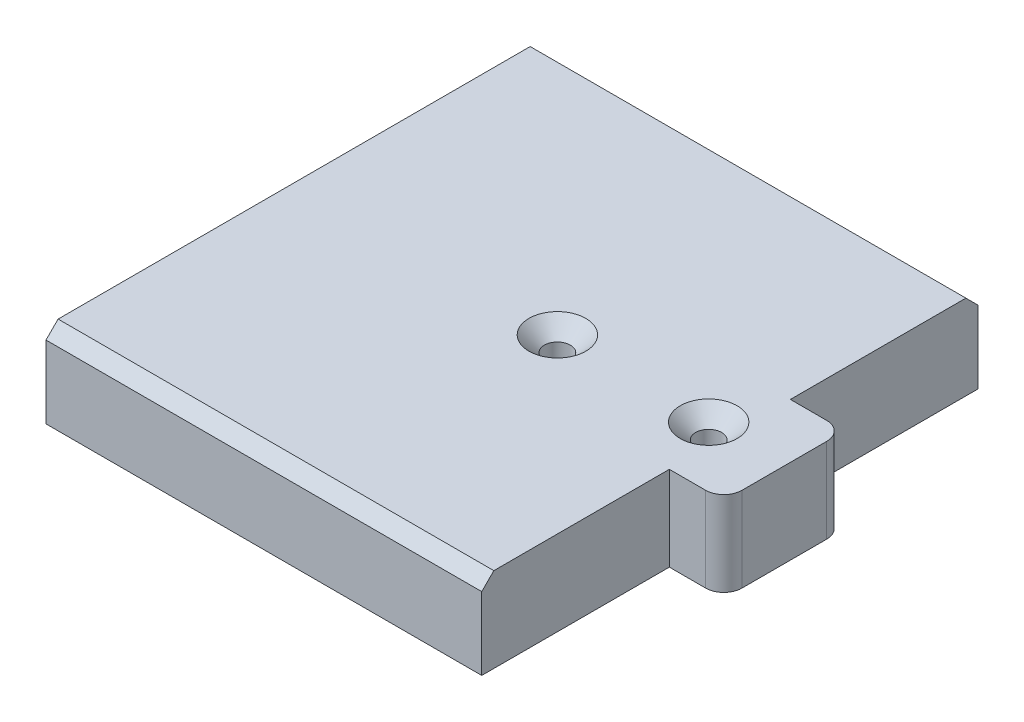
ISO-10303-21;
HEADER;
FILE_DESCRIPTION(('STEP AP214'),'2;1');
FILE_NAME('part.step','',(''),(''),'','','');
FILE_SCHEMA(('AUTOMOTIVE_DESIGN { 1 0 10303 214 1 1 1 1 }'));
ENDSEC;
DATA;
#1=APPLICATION_CONTEXT('core data for automotive mechanical design processes');
#2=APPLICATION_PROTOCOL_DEFINITION('international standard','automotive_design',2000,#1);
#3=PRODUCT_CONTEXT('',#1,'mechanical');
#4=PRODUCT('Part','Part','',(#3));
#5=PRODUCT_RELATED_PRODUCT_CATEGORY('part','',(#4));
#6=PRODUCT_DEFINITION_FORMATION('','',#4);
#7=PRODUCT_DEFINITION_CONTEXT('part definition',#1,'design');
#8=PRODUCT_DEFINITION('design','',#6,#7);
#9=PRODUCT_DEFINITION_SHAPE('','',#8);
#10=(LENGTH_UNIT() NAMED_UNIT(*) SI_UNIT(.MILLI.,.METRE.));
#11=(NAMED_UNIT(*) PLANE_ANGLE_UNIT() SI_UNIT($,.RADIAN.));
#12=(NAMED_UNIT(*) SI_UNIT($,.STERADIAN.) SOLID_ANGLE_UNIT());
#13=UNCERTAINTY_MEASURE_WITH_UNIT(LENGTH_MEASURE(1.E-05),#10,'distance_accuracy_value','');
#14=(GEOMETRIC_REPRESENTATION_CONTEXT(3) GLOBAL_UNCERTAINTY_ASSIGNED_CONTEXT((#13)) GLOBAL_UNIT_ASSIGNED_CONTEXT((#10,
#11,#12)) REPRESENTATION_CONTEXT('',''));
#15=CARTESIAN_POINT('',(0.,0.,0.));
#16=DIRECTION('',(0.,0.,1.));
#17=DIRECTION('',(1.,0.,0.));
#18=AXIS2_PLACEMENT_3D('',#15,#16,#17);
#19=CARTESIAN_POINT('',(-28.,-7.00000000000001,41.001));
#20=DIRECTION('',(1.,0.,0.));
#21=DIRECTION('',(0.,0.,-1.));
#22=AXIS2_PLACEMENT_3D('',#19,#20,#21);
#23=PLANE('',#22);
#24=DIRECTION('',(0.,1.,0.));
#25=VECTOR('',#24,1.);
#26=CARTESIAN_POINT('',(-28.,-28.1896201004171,34.));
#27=LINE('',#26,#25);
#28=CARTESIAN_POINT('',(-28.,-6.99999999999999,34.));
#29=VERTEX_POINT('',#28);
#30=CARTESIAN_POINT('',(-28.,2.99999999999999,34.));
#31=VERTEX_POINT('',#30);
#32=EDGE_CURVE('E177',#29,#31,#27,.T.);
#33=ORIENTED_EDGE('',*,*,#32,.F.);
#34=DIRECTION('',(0.,0.,-1.));
#35=VECTOR('',#34,1.);
#36=CARTESIAN_POINT('',(-28.,-7.00000000000001,41.001));
#37=LINE('',#36,#35);
#38=CARTESIAN_POINT('',(-28.,-6.99999999999999,-34.));
#39=VERTEX_POINT('',#38);
#40=EDGE_CURVE('E210',#29,#39,#37,.T.);
#41=ORIENTED_EDGE('',*,*,#40,.T.);
#42=DIRECTION('',(0.,1.,0.));
#43=VECTOR('',#42,1.);
#44=CARTESIAN_POINT('',(-28.,-28.1896201004171,-34.));
#45=LINE('',#44,#43);
#46=CARTESIAN_POINT('',(-28.,2.99999999999999,-34.));
#47=VERTEX_POINT('',#46);
#48=EDGE_CURVE('E199',#39,#47,#45,.T.);
#49=ORIENTED_EDGE('',*,*,#48,.T.);
#50=DIRECTION('',(0.,0.,-1.));
#51=VECTOR('',#50,1.);
#52=CARTESIAN_POINT('',(-28.,2.99999999999999,41.001));
#53=LINE('',#52,#51);
#54=EDGE_CURVE('E193',#31,#47,#53,.T.);
#55=ORIENTED_EDGE('',*,*,#54,.F.);
#56=EDGE_LOOP('',(#33,#41,#49,#55));
#57=FACE_BOUND('',#56,.T.);
#58=ADVANCED_FACE('F38',(#57),#23,.T.);
#59=CARTESIAN_POINT('',(-8.00000000000001,-7.00000000000001,41.001));
#60=DIRECTION('',(-1.,0.,0.));
#61=DIRECTION('',(0.,0.,1.));
#62=AXIS2_PLACEMENT_3D('',#59,#60,#61);
#63=PLANE('',#62);
#64=DIRECTION('',(0.,1.,0.));
#65=VECTOR('',#64,1.);
#66=CARTESIAN_POINT('',(-8.00000000000001,-28.1896201004171,34.));
#67=LINE('',#66,#65);
#68=CARTESIAN_POINT('',(-8.00000000000001,-6.99999999999999,34.));
#69=VERTEX_POINT('',#68);
#70=CARTESIAN_POINT('',(-8.00000000000001,2.99999999999999,34.));
#71=VERTEX_POINT('',#70);
#72=EDGE_CURVE('E187',#69,#71,#67,.T.);
#73=ORIENTED_EDGE('',*,*,#72,.T.);
#74=DIRECTION('',(0.,0.,-1.));
#75=VECTOR('',#74,1.);
#76=CARTESIAN_POINT('',(-8.00000000000001,2.99999999999999,41.001));
#77=LINE('',#76,#75);
#78=CARTESIAN_POINT('',(-8.00000000000001,2.99999999999999,-34.));
#79=VERTEX_POINT('',#78);
#80=EDGE_CURVE('E195',#71,#79,#77,.T.);
#81=ORIENTED_EDGE('',*,*,#80,.T.);
#82=DIRECTION('',(0.,1.,0.));
#83=VECTOR('',#82,1.);
#84=CARTESIAN_POINT('',(-8.00000000000001,-28.1896201004171,-34.));
#85=LINE('',#84,#83);
#86=CARTESIAN_POINT('',(-8.00000000000001,-6.99999999999999,-34.));
#87=VERTEX_POINT('',#86);
#88=EDGE_CURVE('E595',#87,#79,#85,.T.);
#89=ORIENTED_EDGE('',*,*,#88,.F.);
#90=DIRECTION('',(0.,0.,-1.));
#91=VECTOR('',#90,1.);
#92=CARTESIAN_POINT('',(-8.00000000000001,-7.00000000000001,41.001));
#93=LINE('',#92,#91);
#94=EDGE_CURVE('E202',#69,#87,#93,.T.);
#95=ORIENTED_EDGE('',*,*,#94,.F.);
#96=EDGE_LOOP('',(#73,#81,#89,#95));
#97=FACE_BOUND('',#96,.T.);
#98=ADVANCED_FACE('F368',(#97),#63,.T.);
#99=CARTESIAN_POINT('',(-28.,2.99999999999999,41.001));
#100=DIRECTION('',(0.,-1.,0.));
#101=DIRECTION('',(0.,0.,-1.));
#102=AXIS2_PLACEMENT_3D('',#99,#100,#101);
#103=PLANE('',#102);
#104=DIRECTION('',(-1.,0.,0.));
#105=VECTOR('',#104,1.);
#106=CARTESIAN_POINT('',(-28.,2.99999999999999,34.));
#107=LINE('',#106,#105);
#108=EDGE_CURVE('E181',#71,#31,#107,.T.);
#109=ORIENTED_EDGE('',*,*,#108,.T.);
#110=ORIENTED_EDGE('',*,*,#54,.T.);
#111=DIRECTION('',(-1.,0.,0.));
#112=VECTOR('',#111,1.);
#113=CARTESIAN_POINT('',(-28.,2.99999999999999,-34.));
#114=LINE('',#113,#112);
#115=EDGE_CURVE('E599',#79,#47,#114,.T.);
#116=ORIENTED_EDGE('',*,*,#115,.F.);
#117=ORIENTED_EDGE('',*,*,#80,.F.);
#118=EDGE_LOOP('',(#109,#110,#116,#117));
#119=FACE_BOUND('',#118,.T.);
#120=ADVANCED_FACE('F191',(#119),#103,.T.);
#121=CARTESIAN_POINT('',(-36.,-7.00000000000001,41.));
#122=DIRECTION('',(-1.,0.,0.));
#123=DIRECTION('',(0.,0.,1.));
#124=AXIS2_PLACEMENT_3D('',#121,#122,#123);
#125=PLANE('',#124);
#126=DIRECTION('',(0.,0.,-1.));
#127=VECTOR('',#126,1.);
#128=CARTESIAN_POINT('',(-36.,6.99999999999999,41.));
#129=LINE('',#128,#127);
#130=CARTESIAN_POINT('',(-36.,6.99999999999999,39.));
#131=VERTEX_POINT('',#130);
#132=CARTESIAN_POINT('',(-36.,6.99999999999999,-39.));
#133=VERTEX_POINT('',#132);
#134=EDGE_CURVE('E260',#131,#133,#129,.T.);
#135=ORIENTED_EDGE('',*,*,#134,.T.);
#136=DIRECTION('',(0.,0.707106781186545,0.70710678118655));
#137=VECTOR('',#136,1.);
#138=CARTESIAN_POINT('',(-36.,40.,-5.99999999999971));
#139=LINE('',#138,#137);
#140=CARTESIAN_POINT('',(-36.,4.99999999999999,-41.));
#141=VERTEX_POINT('',#140);
#142=EDGE_CURVE('E292',#133,#141,#139,.F.);
#143=ORIENTED_EDGE('',*,*,#142,.T.);
#144=DIRECTION('',(0.,1.,0.));
#145=VECTOR('',#144,1.);
#146=CARTESIAN_POINT('',(-36.,-7.00000000000001,-41.));
#147=LINE('',#146,#145);
#148=CARTESIAN_POINT('',(-36.,-7.00000000000001,-41.));
#149=VERTEX_POINT('',#148);
#150=EDGE_CURVE('E250',#149,#141,#147,.T.);
#151=ORIENTED_EDGE('',*,*,#150,.F.);
#152=DIRECTION('',(0.,0.,-1.));
#153=VECTOR('',#152,1.);
#154=CARTESIAN_POINT('',(-36.,-7.00000000000001,41.));
#155=LINE('',#154,#153);
#156=CARTESIAN_POINT('',(-36.,-7.00000000000001,-25.));
#157=VERTEX_POINT('',#156);
#158=EDGE_CURVE('E271',#157,#149,#155,.T.);
#159=ORIENTED_EDGE('',*,*,#158,.F.);
#160=DIRECTION('',(0.,-1.,0.));
#161=VECTOR('',#160,1.);
#162=CARTESIAN_POINT('',(-36.,0.,-25.));
#163=LINE('',#162,#161);
#164=CARTESIAN_POINT('',(-36.,0.,-25.));
#165=VERTEX_POINT('',#164);
#166=EDGE_CURVE('E574',#165,#157,#163,.T.);
#167=ORIENTED_EDGE('',*,*,#166,.F.);
#168=DIRECTION('',(0.,0.,1.));
#169=VECTOR('',#168,1.);
#170=CARTESIAN_POINT('',(-36.,0.,-25.));
#171=LINE('',#170,#169);
#172=CARTESIAN_POINT('',(-36.,0.,25.));
#173=VERTEX_POINT('',#172);
#174=EDGE_CURVE('E573',#165,#173,#171,.T.);
#175=ORIENTED_EDGE('',*,*,#174,.T.);
#176=DIRECTION('',(0.,-1.,0.));
#177=VECTOR('',#176,1.);
#178=CARTESIAN_POINT('',(-36.,0.,25.));
#179=LINE('',#178,#177);
#180=CARTESIAN_POINT('',(-36.,-7.00000000000001,25.));
#181=VERTEX_POINT('',#180);
#182=EDGE_CURVE('E200',#173,#181,#179,.T.);
#183=ORIENTED_EDGE('',*,*,#182,.T.);
#184=CARTESIAN_POINT('',(-36.,-7.00000000000001,41.));
#185=VERTEX_POINT('',#184);
#186=EDGE_CURVE('E267',#185,#181,#155,.T.);
#187=ORIENTED_EDGE('',*,*,#186,.F.);
#188=DIRECTION('',(0.,1.,0.));
#189=VECTOR('',#188,1.);
#190=CARTESIAN_POINT('',(-36.,-7.00000000000001,41.));
#191=LINE('',#190,#189);
#192=CARTESIAN_POINT('',(-36.,4.99999999999996,41.));
#193=VERTEX_POINT('',#192);
#194=EDGE_CURVE('E251',#185,#193,#191,.T.);
#195=ORIENTED_EDGE('',*,*,#194,.T.);
#196=DIRECTION('',(0.,0.70710678118655,-0.707106781186545));
#197=VECTOR('',#196,1.);
#198=CARTESIAN_POINT('',(-36.,-1.00000000000006,47.));
#199=LINE('',#198,#197);
#200=EDGE_CURVE('E290',#193,#131,#199,.T.);
#201=ORIENTED_EDGE('',*,*,#200,.T.);
#202=EDGE_LOOP('',(#135,#143,#151,#159,#167,#175,#183,#187,#195,#201));
#203=FACE_BOUND('',#202,.T.);
#204=ADVANCED_FACE('F336',(#203),#125,.T.);
#205=CARTESIAN_POINT('',(-36.,-7.00000000000001,41.));
#206=DIRECTION('',(0.,1.,0.));
#207=DIRECTION('',(0.,0.,1.));
#208=AXIS2_PLACEMENT_3D('',#205,#206,#207);
#209=PLANE('',#208);
#210=ORIENTED_EDGE('',*,*,#40,.F.);
#211=DIRECTION('',(1.,0.,0.));
#212=VECTOR('',#211,1.);
#213=CARTESIAN_POINT('',(-28.,-6.99999999999999,34.));
#214=LINE('',#213,#212);
#215=EDGE_CURVE('E183',#29,#69,#214,.T.);
#216=ORIENTED_EDGE('',*,*,#215,.T.);
#217=ORIENTED_EDGE('',*,*,#94,.T.);
#218=DIRECTION('',(1.,0.,0.));
#219=VECTOR('',#218,1.);
#220=CARTESIAN_POINT('',(-28.,-6.99999999999999,-34.));
#221=LINE('',#220,#219);
#222=EDGE_CURVE('E569',#39,#87,#221,.T.);
#223=ORIENTED_EDGE('',*,*,#222,.F.);
#224=EDGE_LOOP('',(#210,#216,#217,#223));
#225=FACE_BOUND('',#224,.T.);
#226=CARTESIAN_POINT('',(7.5000000000004,-6.99999999999999,0.));
#227=DIRECTION('',(0.,1.,0.));
#228=DIRECTION('',(0.,0.,1.));
#229=AXIS2_PLACEMENT_3D('',#226,#227,#228);
#230=CIRCLE('',#229,2.14999999999999);
#231=CARTESIAN_POINT('',(7.5000000000004,-6.99999999999999,2.14999999999999));
#232=VERTEX_POINT('',#231);
#233=EDGE_CURVE('E227',#232,#232,#230,.T.);
#234=ORIENTED_EDGE('',*,*,#233,.T.);
#235=EDGE_LOOP('',(#234));
#236=FACE_BOUND('',#235,.T.);
#237=CARTESIAN_POINT('',(32.5000000000003,-6.99999999999999,0.));
#238=DIRECTION('',(0.,1.,0.));
#239=DIRECTION('',(0.,0.,1.));
#240=AXIS2_PLACEMENT_3D('',#237,#238,#239);
#241=CIRCLE('',#240,2.14999999999999);
#242=CARTESIAN_POINT('',(32.5000000000003,-6.99999999999999,2.14999999999999));
#243=VERTEX_POINT('',#242);
#244=EDGE_CURVE('E218',#243,#243,#241,.T.);
#245=ORIENTED_EDGE('',*,*,#244,.T.);
#246=EDGE_LOOP('',(#245));
#247=FACE_BOUND('',#246,.T.);
#248=DIRECTION('',(1.,0.,0.));
#249=VECTOR('',#248,1.);
#250=CARTESIAN_POINT('',(45.,-6.99999999999999,-10.));
#251=LINE('',#250,#249);
#252=CARTESIAN_POINT('',(36.,-7.00000000000001,-10.));
#253=VERTEX_POINT('',#252);
#254=CARTESIAN_POINT('',(42.,-6.99999999999999,-10.));
#255=VERTEX_POINT('',#254);
#256=EDGE_CURVE('E231',#253,#255,#251,.T.);
#257=ORIENTED_EDGE('',*,*,#256,.T.);
#258=CARTESIAN_POINT('',(42.,-6.99999999999999,-7.));
#259=DIRECTION('',(0.,1.,0.));
#260=DIRECTION('',(0.,0.,1.));
#261=AXIS2_PLACEMENT_3D('',#258,#259,#260);
#262=CIRCLE('',#261,3.);
#263=CARTESIAN_POINT('',(45.,-6.99999999999999,-7.));
#264=VERTEX_POINT('',#263);
#265=EDGE_CURVE('E46',#255,#264,#262,.F.);
#266=ORIENTED_EDGE('',*,*,#265,.T.);
#267=DIRECTION('',(0.,0.,1.));
#268=VECTOR('',#267,1.);
#269=CARTESIAN_POINT('',(45.,-6.99999999999999,-10.));
#270=LINE('',#269,#268);
#271=CARTESIAN_POINT('',(45.,-6.99999999999999,7.));
#272=VERTEX_POINT('',#271);
#273=EDGE_CURVE('E236',#264,#272,#270,.T.);
#274=ORIENTED_EDGE('',*,*,#273,.T.);
#275=CARTESIAN_POINT('',(42.,-6.99999999999999,7.));
#276=DIRECTION('',(0.,1.,0.));
#277=DIRECTION('',(0.,0.,1.));
#278=AXIS2_PLACEMENT_3D('',#275,#276,#277);
#279=CIRCLE('',#278,3.);
#280=CARTESIAN_POINT('',(42.,-6.99999999999999,10.));
#281=VERTEX_POINT('',#280);
#282=EDGE_CURVE('E53',#272,#281,#279,.F.);
#283=ORIENTED_EDGE('',*,*,#282,.T.);
#284=DIRECTION('',(-1.,0.,0.));
#285=VECTOR('',#284,1.);
#286=CARTESIAN_POINT('',(45.,-6.99999999999999,10.));
#287=LINE('',#286,#285);
#288=CARTESIAN_POINT('',(36.,-7.00000000000001,10.));
#289=VERTEX_POINT('',#288);
#290=EDGE_CURVE('E233',#281,#289,#287,.T.);
#291=ORIENTED_EDGE('',*,*,#290,.T.);
#292=DIRECTION('',(0.,0.,-1.));
#293=VECTOR('',#292,1.);
#294=CARTESIAN_POINT('',(36.,-7.00000000000001,41.));
#295=LINE('',#294,#293);
#296=CARTESIAN_POINT('',(36.,-7.00000000000001,41.));
#297=VERTEX_POINT('',#296);
#298=EDGE_CURVE('E272',#297,#289,#295,.T.);
#299=ORIENTED_EDGE('',*,*,#298,.F.);
#300=DIRECTION('',(1.,0.,0.));
#301=VECTOR('',#300,1.);
#302=CARTESIAN_POINT('',(-36.,-7.00000000000001,41.));
#303=LINE('',#302,#301);
#304=EDGE_CURVE('E258',#185,#297,#303,.T.);
#305=ORIENTED_EDGE('',*,*,#304,.F.);
#306=ORIENTED_EDGE('',*,*,#186,.T.);
#307=DIRECTION('',(1.,0.,0.));
#308=VECTOR('',#307,1.);
#309=CARTESIAN_POINT('',(-36.,-7.00000000000001,25.));
#310=LINE('',#309,#308);
#311=CARTESIAN_POINT('',(-30.5,-7.00000000000001,25.));
#312=VERTEX_POINT('',#311);
#313=EDGE_CURVE('E563',#181,#312,#310,.T.);
#314=ORIENTED_EDGE('',*,*,#313,.T.);
#315=DIRECTION('',(0.,0.,-1.));
#316=VECTOR('',#315,1.);
#317=CARTESIAN_POINT('',(-30.5,-7.00000000000001,-25.));
#318=LINE('',#317,#316);
#319=CARTESIAN_POINT('',(-30.5,-7.00000000000001,-25.));
#320=VERTEX_POINT('',#319);
#321=EDGE_CURVE('E568',#312,#320,#318,.T.);
#322=ORIENTED_EDGE('',*,*,#321,.T.);
#323=DIRECTION('',(-1.,0.,0.));
#324=VECTOR('',#323,1.);
#325=CARTESIAN_POINT('',(-36.,-7.00000000000001,-25.));
#326=LINE('',#325,#324);
#327=EDGE_CURVE('E577',#320,#157,#326,.T.);
#328=ORIENTED_EDGE('',*,*,#327,.T.);
#329=ORIENTED_EDGE('',*,*,#158,.T.);
#330=DIRECTION('',(1.,0.,0.));
#331=VECTOR('',#330,1.);
#332=CARTESIAN_POINT('',(-36.,-7.00000000000001,-41.));
#333=LINE('',#332,#331);
#334=CARTESIAN_POINT('',(36.,-7.00000000000001,-41.));
#335=VERTEX_POINT('',#334);
#336=EDGE_CURVE('E255',#149,#335,#333,.T.);
#337=ORIENTED_EDGE('',*,*,#336,.T.);
#338=EDGE_CURVE('E275',#253,#335,#295,.T.);
#339=ORIENTED_EDGE('',*,*,#338,.F.);
#340=EDGE_LOOP('',(#257,#266,#274,#283,#291,#299,#305,#306,#314,#322,#328,#329,#337,#339));
#341=FACE_BOUND('',#340,.T.);
#342=ADVANCED_FACE('F310',(#225,#236,#247,#341),#209,.F.);
#343=CARTESIAN_POINT('',(0.,0.,41.));
#344=DIRECTION('',(0.,0.,-1.));
#345=DIRECTION('',(-1.,0.,0.));
#346=AXIS2_PLACEMENT_3D('',#343,#344,#345);
#347=PLANE('',#346);
#348=ORIENTED_EDGE('',*,*,#304,.T.);
#349=DIRECTION('',(0.,1.,0.));
#350=VECTOR('',#349,1.);
#351=CARTESIAN_POINT('',(36.,-7.00000000000001,41.));
#352=LINE('',#351,#350);
#353=CARTESIAN_POINT('',(36.,4.99999999999996,41.));
#354=VERTEX_POINT('',#353);
#355=EDGE_CURVE('E254',#297,#354,#352,.T.);
#356=ORIENTED_EDGE('',*,*,#355,.T.);
#357=DIRECTION('',(-1.,0.,0.));
#358=VECTOR('',#357,1.);
#359=CARTESIAN_POINT('',(-36.,4.99999999999996,41.));
#360=LINE('',#359,#358);
#361=EDGE_CURVE('E296',#354,#193,#360,.T.);
#362=ORIENTED_EDGE('',*,*,#361,.T.);
#363=ORIENTED_EDGE('',*,*,#194,.F.);
#364=EDGE_LOOP('',(#348,#356,#362,#363));
#365=FACE_BOUND('',#364,.T.);
#366=ADVANCED_FACE('F353',(#365),#347,.F.);
#367=CARTESIAN_POINT('',(0.,0.,-41.));
#368=DIRECTION('',(0.,0.,-1.));
#369=DIRECTION('',(-1.,0.,0.));
#370=AXIS2_PLACEMENT_3D('',#367,#368,#369);
#371=PLANE('',#370);
#372=DIRECTION('',(0.,1.,0.));
#373=VECTOR('',#372,1.);
#374=CARTESIAN_POINT('',(36.,-7.00000000000001,-41.));
#375=LINE('',#374,#373);
#376=CARTESIAN_POINT('',(36.,4.99999999999999,-41.));
#377=VERTEX_POINT('',#376);
#378=EDGE_CURVE('E263',#335,#377,#375,.T.);
#379=ORIENTED_EDGE('',*,*,#378,.F.);
#380=ORIENTED_EDGE('',*,*,#336,.F.);
#381=ORIENTED_EDGE('',*,*,#150,.T.);
#382=DIRECTION('',(1.,0.,0.));
#383=VECTOR('',#382,1.);
#384=CARTESIAN_POINT('',(0.,4.99999999999999,-41.));
#385=LINE('',#384,#383);
#386=EDGE_CURVE('E270',#141,#377,#385,.T.);
#387=ORIENTED_EDGE('',*,*,#386,.T.);
#388=EDGE_LOOP('',(#379,#380,#381,#387));
#389=FACE_BOUND('',#388,.T.);
#390=ADVANCED_FACE('F333',(#389),#371,.T.);
#391=CARTESIAN_POINT('',(36.,-7.00000000000001,41.));
#392=DIRECTION('',(-1.,0.,0.));
#393=DIRECTION('',(0.,0.,1.));
#394=AXIS2_PLACEMENT_3D('',#391,#392,#393);
#395=PLANE('',#394);
#396=ORIENTED_EDGE('',*,*,#378,.T.);
#397=DIRECTION('',(0.,-0.707106781186545,-0.70710678118655));
#398=VECTOR('',#397,1.);
#399=CARTESIAN_POINT('',(36.,4.99999999999999,-41.));
#400=LINE('',#399,#398);
#401=CARTESIAN_POINT('',(36.,6.99999999999999,-39.));
#402=VERTEX_POINT('',#401);
#403=EDGE_CURVE('E283',#377,#402,#400,.F.);
#404=ORIENTED_EDGE('',*,*,#403,.T.);
#405=DIRECTION('',(0.,0.,-1.));
#406=VECTOR('',#405,1.);
#407=CARTESIAN_POINT('',(36.,6.99999999999999,41.));
#408=LINE('',#407,#406);
#409=CARTESIAN_POINT('',(36.,6.99999999999999,-10.));
#410=VERTEX_POINT('',#409);
#411=EDGE_CURVE('E278',#410,#402,#408,.T.);
#412=ORIENTED_EDGE('',*,*,#411,.F.);
#413=DIRECTION('',(0.,1.,0.));
#414=VECTOR('',#413,1.);
#415=CARTESIAN_POINT('',(36.,-28.9317121994613,-10.));
#416=LINE('',#415,#414);
#417=EDGE_CURVE('E244',#253,#410,#416,.T.);
#418=ORIENTED_EDGE('',*,*,#417,.F.);
#419=ORIENTED_EDGE('',*,*,#338,.T.);
#420=EDGE_LOOP('',(#396,#404,#412,#418,#419));
#421=FACE_BOUND('',#420,.T.);
#422=ADVANCED_FACE('F326',(#421),#395,.F.);
#423=CARTESIAN_POINT('',(36.,6.99999999999999,39.));
#424=VERTEX_POINT('',#423);
#425=CARTESIAN_POINT('',(36.,6.99999999999999,10.));
#426=VERTEX_POINT('',#425);
#427=EDGE_CURVE('E276',#424,#426,#408,.T.);
#428=ORIENTED_EDGE('',*,*,#427,.F.);
#429=DIRECTION('',(0.,-0.70710678118655,0.707106781186545));
#430=VECTOR('',#429,1.);
#431=CARTESIAN_POINT('',(36.,6.99999999999999,39.));
#432=LINE('',#431,#430);
#433=EDGE_CURVE('E294',#424,#354,#432,.T.);
#434=ORIENTED_EDGE('',*,*,#433,.T.);
#435=ORIENTED_EDGE('',*,*,#355,.F.);
#436=ORIENTED_EDGE('',*,*,#298,.T.);
#437=DIRECTION('',(0.,1.,0.));
#438=VECTOR('',#437,1.);
#439=CARTESIAN_POINT('',(36.,-28.9317121994613,10.));
#440=LINE('',#439,#438);
#441=EDGE_CURVE('E234',#289,#426,#440,.T.);
#442=ORIENTED_EDGE('',*,*,#441,.T.);
#443=EDGE_LOOP('',(#428,#434,#435,#436,#442));
#444=FACE_BOUND('',#443,.T.);
#445=ADVANCED_FACE('F351',(#444),#395,.F.);
#446=CARTESIAN_POINT('',(-36.,6.99999999999999,41.));
#447=DIRECTION('',(0.,1.,0.));
#448=DIRECTION('',(0.,0.,1.));
#449=AXIS2_PLACEMENT_3D('',#446,#447,#448);
#450=PLANE('',#449);
#451=CARTESIAN_POINT('',(32.5000000000003,6.99999999999999,0.));
#452=DIRECTION('',(0.,1.,0.));
#453=DIRECTION('',(0.,0.,1.));
#454=AXIS2_PLACEMENT_3D('',#451,#452,#453);
#455=CIRCLE('',#454,4.7);
#456=CARTESIAN_POINT('',(32.5000000000003,6.99999999999999,4.7));
#457=VERTEX_POINT('',#456);
#458=EDGE_CURVE('E212',#457,#457,#455,.T.);
#459=ORIENTED_EDGE('',*,*,#458,.F.);
#460=EDGE_LOOP('',(#459));
#461=FACE_BOUND('',#460,.T.);
#462=CARTESIAN_POINT('',(7.5000000000004,6.99999999999999,0.));
#463=DIRECTION('',(0.,1.,0.));
#464=DIRECTION('',(0.,0.,1.));
#465=AXIS2_PLACEMENT_3D('',#462,#463,#464);
#466=CIRCLE('',#465,4.7);
#467=CARTESIAN_POINT('',(7.5000000000004,6.99999999999999,4.7));
#468=VERTEX_POINT('',#467);
#469=EDGE_CURVE('E221',#468,#468,#466,.T.);
#470=ORIENTED_EDGE('',*,*,#469,.F.);
#471=EDGE_LOOP('',(#470));
#472=FACE_BOUND('',#471,.T.);
#473=DIRECTION('',(0.,0.,-1.));
#474=VECTOR('',#473,1.);
#475=CARTESIAN_POINT('',(45.,6.99999999999999,-10.));
#476=LINE('',#475,#474);
#477=CARTESIAN_POINT('',(45.,6.99999999999999,7.));
#478=VERTEX_POINT('',#477);
#479=CARTESIAN_POINT('',(45.,6.99999999999999,-7.));
#480=VERTEX_POINT('',#479);
#481=EDGE_CURVE('E239',#478,#480,#476,.T.);
#482=ORIENTED_EDGE('',*,*,#481,.T.);
#483=CARTESIAN_POINT('',(42.,6.99999999999999,-7.));
#484=DIRECTION('',(0.,1.,0.));
#485=DIRECTION('',(0.,0.,1.));
#486=AXIS2_PLACEMENT_3D('',#483,#484,#485);
#487=CIRCLE('',#486,3.);
#488=CARTESIAN_POINT('',(42.,6.99999999999999,-10.));
#489=VERTEX_POINT('',#488);
#490=EDGE_CURVE('E305',#480,#489,#487,.T.);
#491=ORIENTED_EDGE('',*,*,#490,.T.);
#492=DIRECTION('',(-1.,0.,0.));
#493=VECTOR('',#492,1.);
#494=CARTESIAN_POINT('',(45.,6.99999999999999,-10.));
#495=LINE('',#494,#493);
#496=EDGE_CURVE('E242',#489,#410,#495,.T.);
#497=ORIENTED_EDGE('',*,*,#496,.T.);
#498=ORIENTED_EDGE('',*,*,#411,.T.);
#499=DIRECTION('',(-1.,0.,0.));
#500=VECTOR('',#499,1.);
#501=CARTESIAN_POINT('',(-36.,6.99999999999999,-39.));
#502=LINE('',#501,#500);
#503=EDGE_CURVE('E288',#402,#133,#502,.T.);
#504=ORIENTED_EDGE('',*,*,#503,.T.);
#505=ORIENTED_EDGE('',*,*,#134,.F.);
#506=DIRECTION('',(1.,0.,0.));
#507=VECTOR('',#506,1.);
#508=CARTESIAN_POINT('',(36.,6.99999999999999,39.));
#509=LINE('',#508,#507);
#510=EDGE_CURVE('E285',#131,#424,#509,.T.);
#511=ORIENTED_EDGE('',*,*,#510,.T.);
#512=ORIENTED_EDGE('',*,*,#427,.T.);
#513=DIRECTION('',(1.,0.,0.));
#514=VECTOR('',#513,1.);
#515=CARTESIAN_POINT('',(45.,6.99999999999999,10.));
#516=LINE('',#515,#514);
#517=CARTESIAN_POINT('',(42.,6.99999999999999,10.));
#518=VERTEX_POINT('',#517);
#519=EDGE_CURVE('E230',#426,#518,#516,.T.);
#520=ORIENTED_EDGE('',*,*,#519,.T.);
#521=CARTESIAN_POINT('',(42.,6.99999999999999,7.));
#522=DIRECTION('',(0.,1.,0.));
#523=DIRECTION('',(0.,0.,1.));
#524=AXIS2_PLACEMENT_3D('',#521,#522,#523);
#525=CIRCLE('',#524,3.);
#526=EDGE_CURVE('E303',#518,#478,#525,.T.);
#527=ORIENTED_EDGE('',*,*,#526,.T.);
#528=EDGE_LOOP('',(#482,#491,#497,#498,#504,#505,#511,#512,#520,#527));
#529=FACE_BOUND('',#528,.T.);
#530=ADVANCED_FACE('F320',(#461,#472,#529),#450,.T.);
#531=CARTESIAN_POINT('',(45.,-28.9317121994613,10.));
#532=DIRECTION('',(0.,0.,1.));
#533=DIRECTION('',(1.,0.,0.));
#534=AXIS2_PLACEMENT_3D('',#531,#532,#533);
#535=PLANE('',#534);
#536=ORIENTED_EDGE('',*,*,#290,.F.);
#537=DIRECTION('',(0.,1.,0.));
#538=VECTOR('',#537,1.);
#539=CARTESIAN_POINT('',(42.,-28.9317121994613,10.));
#540=LINE('',#539,#538);
#541=EDGE_CURVE('E11',#281,#518,#540,.T.);
#542=ORIENTED_EDGE('',*,*,#541,.T.);
#543=ORIENTED_EDGE('',*,*,#519,.F.);
#544=ORIENTED_EDGE('',*,*,#441,.F.);
#545=EDGE_LOOP('',(#536,#542,#543,#544));
#546=FACE_BOUND('',#545,.T.);
#547=ADVANCED_FACE('F360',(#546),#535,.T.);
#548=CARTESIAN_POINT('',(45.,-28.9317121994613,-10.));
#549=DIRECTION('',(0.,0.,-1.));
#550=DIRECTION('',(-1.,0.,0.));
#551=AXIS2_PLACEMENT_3D('',#548,#549,#550);
#552=PLANE('',#551);
#553=ORIENTED_EDGE('',*,*,#496,.F.);
#554=DIRECTION('',(0.,1.,0.));
#555=VECTOR('',#554,1.);
#556=CARTESIAN_POINT('',(42.,-28.9317121994613,-10.));
#557=LINE('',#556,#555);
#558=EDGE_CURVE('E61',#489,#255,#557,.F.);
#559=ORIENTED_EDGE('',*,*,#558,.T.);
#560=ORIENTED_EDGE('',*,*,#256,.F.);
#561=ORIENTED_EDGE('',*,*,#417,.T.);
#562=EDGE_LOOP('',(#553,#559,#560,#561));
#563=FACE_BOUND('',#562,.T.);
#564=ADVANCED_FACE('F323',(#563),#552,.T.);
#565=CARTESIAN_POINT('',(45.,-28.9317121994613,-10.));
#566=DIRECTION('',(1.,0.,0.));
#567=DIRECTION('',(0.,0.,-1.));
#568=AXIS2_PLACEMENT_3D('',#565,#566,#567);
#569=PLANE('',#568);
#570=ORIENTED_EDGE('',*,*,#273,.F.);
#571=DIRECTION('',(0.,1.,0.));
#572=VECTOR('',#571,1.);
#573=CARTESIAN_POINT('',(45.,-28.9317121994613,-7.));
#574=LINE('',#573,#572);
#575=EDGE_CURVE('E300',#264,#480,#574,.T.);
#576=ORIENTED_EDGE('',*,*,#575,.T.);
#577=ORIENTED_EDGE('',*,*,#481,.F.);
#578=DIRECTION('',(0.,1.,0.));
#579=VECTOR('',#578,1.);
#580=CARTESIAN_POINT('',(45.,-28.9317121994613,7.));
#581=LINE('',#580,#579);
#582=EDGE_CURVE('E298',#478,#272,#581,.F.);
#583=ORIENTED_EDGE('',*,*,#582,.T.);
#584=EDGE_LOOP('',(#570,#576,#577,#583));
#585=FACE_BOUND('',#584,.T.);
#586=ADVANCED_FACE('F315',(#585),#569,.T.);
#587=CARTESIAN_POINT('',(7.5000000000004,6.99999999999999,0.));
#588=DIRECTION('',(0.,1.,0.));
#589=DIRECTION('',(0.,0.,1.));
#590=AXIS2_PLACEMENT_3D('',#587,#588,#589);
#591=CYLINDRICAL_SURFACE('',#590,2.14999999999999);
#592=ORIENTED_EDGE('',*,*,#233,.F.);
#593=EDGE_LOOP('',(#592));
#594=FACE_BOUND('',#593,.T.);
#595=CARTESIAN_POINT('',(7.5000000000004,4.45,0.));
#596=DIRECTION('',(0.,1.,0.));
#597=DIRECTION('',(0.,0.,1.));
#598=AXIS2_PLACEMENT_3D('',#595,#596,#597);
#599=CIRCLE('',#598,2.15);
#600=CARTESIAN_POINT('',(7.5000000000004,4.45,2.15));
#601=VERTEX_POINT('',#600);
#602=EDGE_CURVE('E224',#601,#601,#599,.T.);
#603=ORIENTED_EDGE('',*,*,#602,.T.);
#604=EDGE_LOOP('',(#603));
#605=FACE_BOUND('',#604,.T.);
#606=ADVANCED_FACE('F389',(#594,#605),#591,.F.);
#607=CARTESIAN_POINT('',(7.5000000000004,6.99999999999999,0.));
#608=DIRECTION('',(0.,1.,0.));
#609=DIRECTION('',(0.,0.,1.));
#610=AXIS2_PLACEMENT_3D('',#607,#608,#609);
#611=CONICAL_SURFACE('',#610,4.7,0.785398163397448);
#612=ORIENTED_EDGE('',*,*,#602,.F.);
#613=EDGE_LOOP('',(#612));
#614=FACE_BOUND('',#613,.T.);
#615=ORIENTED_EDGE('',*,*,#469,.T.);
#616=EDGE_LOOP('',(#615));
#617=FACE_BOUND('',#616,.T.);
#618=ADVANCED_FACE('F385',(#614,#617),#611,.F.);
#619=CARTESIAN_POINT('',(32.5000000000003,6.99999999999999,0.));
#620=DIRECTION('',(0.,1.,0.));
#621=DIRECTION('',(0.,0.,1.));
#622=AXIS2_PLACEMENT_3D('',#619,#620,#621);
#623=CYLINDRICAL_SURFACE('',#622,2.14999999999999);
#624=ORIENTED_EDGE('',*,*,#244,.F.);
#625=EDGE_LOOP('',(#624));
#626=FACE_BOUND('',#625,.T.);
#627=CARTESIAN_POINT('',(32.5000000000003,4.45,0.));
#628=DIRECTION('',(0.,1.,0.));
#629=DIRECTION('',(0.,0.,1.));
#630=AXIS2_PLACEMENT_3D('',#627,#628,#629);
#631=CIRCLE('',#630,2.15);
#632=CARTESIAN_POINT('',(32.5000000000003,4.45,2.15));
#633=VERTEX_POINT('',#632);
#634=EDGE_CURVE('E215',#633,#633,#631,.T.);
#635=ORIENTED_EDGE('',*,*,#634,.T.);
#636=EDGE_LOOP('',(#635));
#637=FACE_BOUND('',#636,.T.);
#638=ADVANCED_FACE('F381',(#626,#637),#623,.F.);
#639=CARTESIAN_POINT('',(32.5000000000003,6.99999999999999,0.));
#640=DIRECTION('',(0.,1.,0.));
#641=DIRECTION('',(0.,0.,1.));
#642=AXIS2_PLACEMENT_3D('',#639,#640,#641);
#643=CONICAL_SURFACE('',#642,4.7,0.785398163397447);
#644=ORIENTED_EDGE('',*,*,#634,.F.);
#645=EDGE_LOOP('',(#644));
#646=FACE_BOUND('',#645,.T.);
#647=ORIENTED_EDGE('',*,*,#458,.T.);
#648=EDGE_LOOP('',(#647));
#649=FACE_BOUND('',#648,.T.);
#650=ADVANCED_FACE('F377',(#646,#649),#643,.F.);
#651=CARTESIAN_POINT('',(-36.,0.,25.));
#652=DIRECTION('',(0.,0.,-1.));
#653=DIRECTION('',(-1.,0.,0.));
#654=AXIS2_PLACEMENT_3D('',#651,#652,#653);
#655=PLANE('',#654);
#656=ORIENTED_EDGE('',*,*,#313,.F.);
#657=ORIENTED_EDGE('',*,*,#182,.F.);
#658=DIRECTION('',(1.,0.,0.));
#659=VECTOR('',#658,1.);
#660=CARTESIAN_POINT('',(-36.,0.,25.));
#661=LINE('',#660,#659);
#662=CARTESIAN_POINT('',(-30.5,0.,25.));
#663=VERTEX_POINT('',#662);
#664=EDGE_CURVE('E576',#173,#663,#661,.T.);
#665=ORIENTED_EDGE('',*,*,#664,.T.);
#666=DIRECTION('',(0.,-1.,0.));
#667=VECTOR('',#666,1.);
#668=CARTESIAN_POINT('',(-30.5,0.,25.));
#669=LINE('',#668,#667);
#670=EDGE_CURVE('E205',#663,#312,#669,.T.);
#671=ORIENTED_EDGE('',*,*,#670,.T.);
#672=EDGE_LOOP('',(#656,#657,#665,#671));
#673=FACE_BOUND('',#672,.T.);
#674=ADVANCED_FACE('F380',(#673),#655,.T.);
#675=CARTESIAN_POINT('',(-30.5,0.,-25.));
#676=DIRECTION('',(-1.,0.,0.));
#677=DIRECTION('',(0.,0.,1.));
#678=AXIS2_PLACEMENT_3D('',#675,#676,#677);
#679=PLANE('',#678);
#680=ORIENTED_EDGE('',*,*,#321,.F.);
#681=ORIENTED_EDGE('',*,*,#670,.F.);
#682=DIRECTION('',(0.,0.,-1.));
#683=VECTOR('',#682,1.);
#684=CARTESIAN_POINT('',(-30.5,0.,-25.));
#685=LINE('',#684,#683);
#686=CARTESIAN_POINT('',(-30.5,0.,-25.));
#687=VERTEX_POINT('',#686);
#688=EDGE_CURVE('E579',#663,#687,#685,.T.);
#689=ORIENTED_EDGE('',*,*,#688,.T.);
#690=DIRECTION('',(0.,-1.,0.));
#691=VECTOR('',#690,1.);
#692=CARTESIAN_POINT('',(-30.5,0.,-25.));
#693=LINE('',#692,#691);
#694=EDGE_CURVE('E590',#687,#320,#693,.T.);
#695=ORIENTED_EDGE('',*,*,#694,.T.);
#696=EDGE_LOOP('',(#680,#681,#689,#695));
#697=FACE_BOUND('',#696,.T.);
#698=ADVANCED_FACE('F435',(#697),#679,.T.);
#699=CARTESIAN_POINT('',(-36.,0.,-25.));
#700=DIRECTION('',(0.,0.,1.));
#701=DIRECTION('',(1.,0.,0.));
#702=AXIS2_PLACEMENT_3D('',#699,#700,#701);
#703=PLANE('',#702);
#704=ORIENTED_EDGE('',*,*,#327,.F.);
#705=ORIENTED_EDGE('',*,*,#694,.F.);
#706=DIRECTION('',(-1.,0.,0.));
#707=VECTOR('',#706,1.);
#708=CARTESIAN_POINT('',(-36.,0.,-25.));
#709=LINE('',#708,#707);
#710=EDGE_CURVE('E586',#687,#165,#709,.T.);
#711=ORIENTED_EDGE('',*,*,#710,.T.);
#712=ORIENTED_EDGE('',*,*,#166,.T.);
#713=EDGE_LOOP('',(#704,#705,#711,#712));
#714=FACE_BOUND('',#713,.T.);
#715=ADVANCED_FACE('F431',(#714),#703,.T.);
#716=CARTESIAN_POINT('',(0.,0.,0.));
#717=DIRECTION('',(0.,1.,0.));
#718=DIRECTION('',(0.,0.,1.));
#719=AXIS2_PLACEMENT_3D('',#716,#717,#718);
#720=PLANE('',#719);
#721=ORIENTED_EDGE('',*,*,#174,.F.);
#722=ORIENTED_EDGE('',*,*,#710,.F.);
#723=ORIENTED_EDGE('',*,*,#688,.F.);
#724=ORIENTED_EDGE('',*,*,#664,.F.);
#725=EDGE_LOOP('',(#721,#722,#723,#724));
#726=FACE_BOUND('',#725,.T.);
#727=ADVANCED_FACE('F416',(#726),#720,.F.);
#728=CARTESIAN_POINT('',(0.,4.99999999999999,-41.));
#729=DIRECTION('',(0.,-0.70710678118655,0.707106781186545));
#730=DIRECTION('',(1.,0.,0.));
#731=AXIS2_PLACEMENT_3D('',#728,#729,#730);
#732=PLANE('',#731);
#733=ORIENTED_EDGE('',*,*,#142,.F.);
#734=ORIENTED_EDGE('',*,*,#503,.F.);
#735=ORIENTED_EDGE('',*,*,#403,.F.);
#736=ORIENTED_EDGE('',*,*,#386,.F.);
#737=EDGE_LOOP('',(#733,#734,#735,#736));
#738=FACE_BOUND('',#737,.T.);
#739=ADVANCED_FACE('F342',(#738),#732,.F.);
#740=CARTESIAN_POINT('',(-36.,6.99999999999999,39.));
#741=DIRECTION('',(0.,0.707106781186545,0.70710678118655));
#742=DIRECTION('',(-1.,0.,0.));
#743=AXIS2_PLACEMENT_3D('',#740,#741,#742);
#744=PLANE('',#743);
#745=ORIENTED_EDGE('',*,*,#200,.F.);
#746=ORIENTED_EDGE('',*,*,#361,.F.);
#747=ORIENTED_EDGE('',*,*,#433,.F.);
#748=ORIENTED_EDGE('',*,*,#510,.F.);
#749=EDGE_LOOP('',(#745,#746,#747,#748));
#750=FACE_BOUND('',#749,.T.);
#751=ADVANCED_FACE('F347',(#750),#744,.T.);
#752=CARTESIAN_POINT('',(-28.,-28.1896201004171,-34.));
#753=DIRECTION('',(0.,0.,-1.));
#754=DIRECTION('',(-1.,0.,0.));
#755=AXIS2_PLACEMENT_3D('',#752,#753,#754);
#756=PLANE('',#755);
#757=ORIENTED_EDGE('',*,*,#48,.F.);
#758=ORIENTED_EDGE('',*,*,#222,.T.);
#759=ORIENTED_EDGE('',*,*,#88,.T.);
#760=ORIENTED_EDGE('',*,*,#115,.T.);
#761=EDGE_LOOP('',(#757,#758,#759,#760));
#762=FACE_BOUND('',#761,.T.);
#763=ADVANCED_FACE('F418',(#762),#756,.F.);
#764=CARTESIAN_POINT('',(-28.,-28.1896201004171,34.));
#765=DIRECTION('',(0.,0.,-1.));
#766=DIRECTION('',(-1.,0.,0.));
#767=AXIS2_PLACEMENT_3D('',#764,#765,#766);
#768=PLANE('',#767);
#769=ORIENTED_EDGE('',*,*,#215,.F.);
#770=ORIENTED_EDGE('',*,*,#32,.T.);
#771=ORIENTED_EDGE('',*,*,#108,.F.);
#772=ORIENTED_EDGE('',*,*,#72,.F.);
#773=EDGE_LOOP('',(#769,#770,#771,#772));
#774=FACE_BOUND('',#773,.T.);
#775=ADVANCED_FACE('F179',(#774),#768,.T.);
#776=CARTESIAN_POINT('',(42.,-28.9317121994613,-7.));
#777=DIRECTION('',(0.,1.,0.));
#778=DIRECTION('',(0.,0.,1.));
#779=AXIS2_PLACEMENT_3D('',#776,#777,#778);
#780=CYLINDRICAL_SURFACE('',#779,3.);
#781=ORIENTED_EDGE('',*,*,#265,.F.);
#782=ORIENTED_EDGE('',*,*,#558,.F.);
#783=ORIENTED_EDGE('',*,*,#490,.F.);
#784=ORIENTED_EDGE('',*,*,#575,.F.);
#785=EDGE_LOOP('',(#781,#782,#783,#784));
#786=FACE_BOUND('',#785,.T.);
#787=ADVANCED_FACE('F318',(#786),#780,.T.);
#788=CARTESIAN_POINT('',(42.,-28.9317121994613,7.));
#789=DIRECTION('',(0.,1.,0.));
#790=DIRECTION('',(0.,0.,1.));
#791=AXIS2_PLACEMENT_3D('',#788,#789,#790);
#792=CYLINDRICAL_SURFACE('',#791,3.);
#793=ORIENTED_EDGE('',*,*,#282,.F.);
#794=ORIENTED_EDGE('',*,*,#582,.F.);
#795=ORIENTED_EDGE('',*,*,#526,.F.);
#796=ORIENTED_EDGE('',*,*,#541,.F.);
#797=EDGE_LOOP('',(#793,#794,#795,#796));
#798=FACE_BOUND('',#797,.T.);
#799=ADVANCED_FACE('F40',(#798),#792,.T.);
#800=CLOSED_SHELL('',(#58,#98,#120,#204,#342,#366,#390,#422,#445,#530,#547,#564,#586,#606,#618,
#638,#650,#674,#698,#715,#727,#739,#751,#763,#775,#787,#799));
#801=MANIFOLD_SOLID_BREP('B2',#800);
#802=ADVANCED_BREP_SHAPE_REPRESENTATION('',(#18,#801),#14);
#803=SHAPE_DEFINITION_REPRESENTATION(#9,#802);
ENDSEC;
END-ISO-10303-21;
